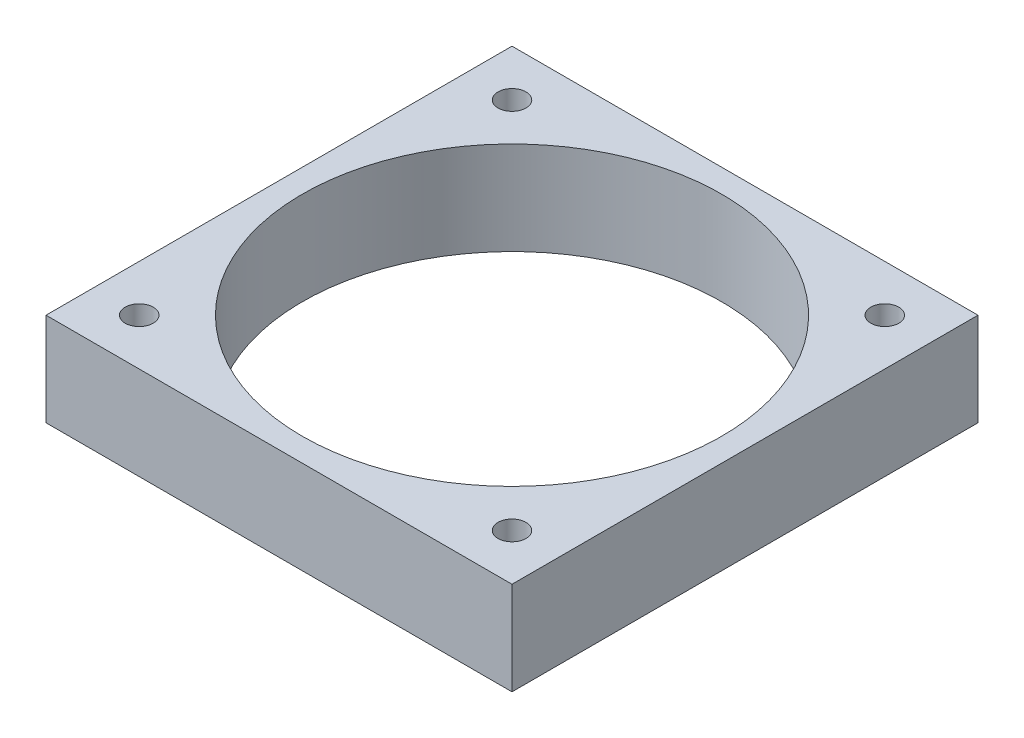
ISO-10303-21;
HEADER;
FILE_DESCRIPTION(('STEP AP214'),'2;1');
FILE_NAME('part.step','',(''),(''),'','','');
FILE_SCHEMA(('AUTOMOTIVE_DESIGN { 1 0 10303 214 1 1 1 1 }'));
ENDSEC;
DATA;
#1=APPLICATION_CONTEXT('core data for automotive mechanical design processes');
#2=APPLICATION_PROTOCOL_DEFINITION('international standard','automotive_design',2000,#1);
#3=PRODUCT_CONTEXT('',#1,'mechanical');
#4=PRODUCT('Part','Part','',(#3));
#5=PRODUCT_RELATED_PRODUCT_CATEGORY('part','',(#4));
#6=PRODUCT_DEFINITION_FORMATION('','',#4);
#7=PRODUCT_DEFINITION_CONTEXT('part definition',#1,'design');
#8=PRODUCT_DEFINITION('design','',#6,#7);
#9=PRODUCT_DEFINITION_SHAPE('','',#8);
#10=(LENGTH_UNIT() NAMED_UNIT(*) SI_UNIT(.MILLI.,.METRE.));
#11=(NAMED_UNIT(*) PLANE_ANGLE_UNIT() SI_UNIT($,.RADIAN.));
#12=(NAMED_UNIT(*) SI_UNIT($,.STERADIAN.) SOLID_ANGLE_UNIT());
#13=UNCERTAINTY_MEASURE_WITH_UNIT(LENGTH_MEASURE(1.E-05),#10,'distance_accuracy_value','');
#14=(GEOMETRIC_REPRESENTATION_CONTEXT(3) GLOBAL_UNCERTAINTY_ASSIGNED_CONTEXT((#13)) GLOBAL_UNIT_ASSIGNED_CONTEXT((#10,
#11,#12)) REPRESENTATION_CONTEXT('',''));
#15=CARTESIAN_POINT('',(0.,0.,0.));
#16=DIRECTION('',(0.,0.,1.));
#17=DIRECTION('',(1.,0.,0.));
#18=AXIS2_PLACEMENT_3D('',#15,#16,#17);
#19=CARTESIAN_POINT('',(0.,10.,-25.));
#20=DIRECTION('',(0.,0.,1.));
#21=DIRECTION('',(1.,0.,0.));
#22=AXIS2_PLACEMENT_3D('',#19,#20,#21);
#23=PLANE('',#22);
#24=DIRECTION('',(-1.,0.,0.));
#25=VECTOR('',#24,1.);
#26=CARTESIAN_POINT('',(0.,0.,-25.));
#27=LINE('',#26,#25);
#28=CARTESIAN_POINT('',(25.,0.,-25.));
#29=VERTEX_POINT('',#28);
#30=CARTESIAN_POINT('',(-25.,0.,-25.));
#31=VERTEX_POINT('',#30);
#32=EDGE_CURVE('E114',#29,#31,#27,.T.);
#33=ORIENTED_EDGE('',*,*,#32,.T.);
#34=DIRECTION('',(0.,-1.,0.));
#35=VECTOR('',#34,1.);
#36=CARTESIAN_POINT('',(-25.,10.,-25.));
#37=LINE('',#36,#35);
#38=CARTESIAN_POINT('',(-25.,10.,-25.));
#39=VERTEX_POINT('',#38);
#40=EDGE_CURVE('E11',#39,#31,#37,.T.);
#41=ORIENTED_EDGE('',*,*,#40,.F.);
#42=DIRECTION('',(-1.,0.,0.));
#43=VECTOR('',#42,1.);
#44=CARTESIAN_POINT('',(0.,10.,-25.));
#45=LINE('',#44,#43);
#46=CARTESIAN_POINT('',(25.,10.,-25.));
#47=VERTEX_POINT('',#46);
#48=EDGE_CURVE('E85',#47,#39,#45,.T.);
#49=ORIENTED_EDGE('',*,*,#48,.F.);
#50=DIRECTION('',(0.,-1.,0.));
#51=VECTOR('',#50,1.);
#52=CARTESIAN_POINT('',(25.,10.,-25.));
#53=LINE('',#52,#51);
#54=EDGE_CURVE('E52',#47,#29,#53,.T.);
#55=ORIENTED_EDGE('',*,*,#54,.T.);
#56=EDGE_LOOP('',(#33,#41,#49,#55));
#57=FACE_BOUND('',#56,.T.);
#58=ADVANCED_FACE('F35',(#57),#23,.F.);
#59=CARTESIAN_POINT('',(-25.,10.,0.));
#60=DIRECTION('',(1.,0.,0.));
#61=DIRECTION('',(0.,0.,-1.));
#62=AXIS2_PLACEMENT_3D('',#59,#60,#61);
#63=PLANE('',#62);
#64=DIRECTION('',(0.,0.,1.));
#65=VECTOR('',#64,1.);
#66=CARTESIAN_POINT('',(-25.,0.,0.));
#67=LINE('',#66,#65);
#68=CARTESIAN_POINT('',(-25.,0.,25.));
#69=VERTEX_POINT('',#68);
#70=EDGE_CURVE('E90',#31,#69,#67,.T.);
#71=ORIENTED_EDGE('',*,*,#70,.T.);
#72=DIRECTION('',(0.,-1.,0.));
#73=VECTOR('',#72,1.);
#74=CARTESIAN_POINT('',(-25.,10.,25.));
#75=LINE('',#74,#73);
#76=CARTESIAN_POINT('',(-25.,10.,25.));
#77=VERTEX_POINT('',#76);
#78=EDGE_CURVE('E44',#77,#69,#75,.T.);
#79=ORIENTED_EDGE('',*,*,#78,.F.);
#80=DIRECTION('',(0.,0.,1.));
#81=VECTOR('',#80,1.);
#82=CARTESIAN_POINT('',(-25.,10.,0.));
#83=LINE('',#82,#81);
#84=EDGE_CURVE('E77',#39,#77,#83,.T.);
#85=ORIENTED_EDGE('',*,*,#84,.F.);
#86=ORIENTED_EDGE('',*,*,#40,.T.);
#87=EDGE_LOOP('',(#71,#79,#85,#86));
#88=FACE_BOUND('',#87,.T.);
#89=ADVANCED_FACE('F89',(#88),#63,.F.);
#90=CARTESIAN_POINT('',(0.,10.,25.));
#91=DIRECTION('',(0.,0.,1.));
#92=DIRECTION('',(1.,0.,0.));
#93=AXIS2_PLACEMENT_3D('',#90,#91,#92);
#94=PLANE('',#93);
#95=DIRECTION('',(-1.,0.,0.));
#96=VECTOR('',#95,1.);
#97=CARTESIAN_POINT('',(0.,0.,25.));
#98=LINE('',#97,#96);
#99=CARTESIAN_POINT('',(25.,0.,25.));
#100=VERTEX_POINT('',#99);
#101=EDGE_CURVE('E117',#100,#69,#98,.T.);
#102=ORIENTED_EDGE('',*,*,#101,.F.);
#103=DIRECTION('',(0.,-1.,0.));
#104=VECTOR('',#103,1.);
#105=CARTESIAN_POINT('',(25.,10.,25.));
#106=LINE('',#105,#104);
#107=CARTESIAN_POINT('',(25.,10.,25.));
#108=VERTEX_POINT('',#107);
#109=EDGE_CURVE('E66',#108,#100,#106,.T.);
#110=ORIENTED_EDGE('',*,*,#109,.F.);
#111=DIRECTION('',(-1.,0.,0.));
#112=VECTOR('',#111,1.);
#113=CARTESIAN_POINT('',(0.,10.,25.));
#114=LINE('',#113,#112);
#115=EDGE_CURVE('E84',#108,#77,#114,.T.);
#116=ORIENTED_EDGE('',*,*,#115,.T.);
#117=ORIENTED_EDGE('',*,*,#78,.T.);
#118=EDGE_LOOP('',(#102,#110,#116,#117));
#119=FACE_BOUND('',#118,.T.);
#120=ADVANCED_FACE('F93',(#119),#94,.T.);
#121=CARTESIAN_POINT('',(-20.,10.,-20.));
#122=DIRECTION('',(0.,-1.,0.));
#123=DIRECTION('',(0.,0.,-1.));
#124=AXIS2_PLACEMENT_3D('',#121,#122,#123);
#125=CYLINDRICAL_SURFACE('',#124,1.5);
#126=CARTESIAN_POINT('',(-20.,10.,-20.));
#127=DIRECTION('',(0.,1.,0.));
#128=DIRECTION('',(0.,0.,1.));
#129=AXIS2_PLACEMENT_3D('',#126,#127,#128);
#130=CIRCLE('',#129,1.5);
#131=CARTESIAN_POINT('',(-20.,10.,-18.5));
#132=VERTEX_POINT('',#131);
#133=EDGE_CURVE('E139',#132,#132,#130,.T.);
#134=ORIENTED_EDGE('',*,*,#133,.T.);
#135=EDGE_LOOP('',(#134));
#136=FACE_BOUND('',#135,.T.);
#137=CARTESIAN_POINT('',(-20.,0.,-20.));
#138=DIRECTION('',(0.,1.,0.));
#139=DIRECTION('',(0.,0.,1.));
#140=AXIS2_PLACEMENT_3D('',#137,#138,#139);
#141=CIRCLE('',#140,1.5);
#142=CARTESIAN_POINT('',(-20.,0.,-18.5));
#143=VERTEX_POINT('',#142);
#144=EDGE_CURVE('E111',#143,#143,#141,.T.);
#145=ORIENTED_EDGE('',*,*,#144,.F.);
#146=EDGE_LOOP('',(#145));
#147=FACE_BOUND('',#146,.T.);
#148=ADVANCED_FACE('F143',(#136,#147),#125,.F.);
#149=CARTESIAN_POINT('',(20.,10.,-20.));
#150=DIRECTION('',(0.,-1.,0.));
#151=DIRECTION('',(0.,0.,-1.));
#152=AXIS2_PLACEMENT_3D('',#149,#150,#151);
#153=CYLINDRICAL_SURFACE('',#152,1.5);
#154=CARTESIAN_POINT('',(20.,10.,-20.));
#155=DIRECTION('',(0.,1.,0.));
#156=DIRECTION('',(0.,0.,1.));
#157=AXIS2_PLACEMENT_3D('',#154,#155,#156);
#158=CIRCLE('',#157,1.5);
#159=CARTESIAN_POINT('',(20.,10.,-18.5));
#160=VERTEX_POINT('',#159);
#161=EDGE_CURVE('E136',#160,#160,#158,.T.);
#162=ORIENTED_EDGE('',*,*,#161,.T.);
#163=EDGE_LOOP('',(#162));
#164=FACE_BOUND('',#163,.T.);
#165=CARTESIAN_POINT('',(20.,0.,-20.));
#166=DIRECTION('',(0.,1.,0.));
#167=DIRECTION('',(0.,0.,1.));
#168=AXIS2_PLACEMENT_3D('',#165,#166,#167);
#169=CIRCLE('',#168,1.5);
#170=CARTESIAN_POINT('',(20.,0.,-18.5));
#171=VERTEX_POINT('',#170);
#172=EDGE_CURVE('E108',#171,#171,#169,.T.);
#173=ORIENTED_EDGE('',*,*,#172,.F.);
#174=EDGE_LOOP('',(#173));
#175=FACE_BOUND('',#174,.T.);
#176=ADVANCED_FACE('F169',(#164,#175),#153,.F.);
#177=CARTESIAN_POINT('',(-20.,10.,20.));
#178=DIRECTION('',(0.,-1.,0.));
#179=DIRECTION('',(0.,0.,-1.));
#180=AXIS2_PLACEMENT_3D('',#177,#178,#179);
#181=CYLINDRICAL_SURFACE('',#180,1.5);
#182=CARTESIAN_POINT('',(-20.,10.,20.));
#183=DIRECTION('',(0.,1.,0.));
#184=DIRECTION('',(0.,0.,1.));
#185=AXIS2_PLACEMENT_3D('',#182,#183,#184);
#186=CIRCLE('',#185,1.5);
#187=CARTESIAN_POINT('',(-20.,10.,21.5));
#188=VERTEX_POINT('',#187);
#189=EDGE_CURVE('E131',#188,#188,#186,.T.);
#190=ORIENTED_EDGE('',*,*,#189,.T.);
#191=EDGE_LOOP('',(#190));
#192=FACE_BOUND('',#191,.T.);
#193=CARTESIAN_POINT('',(-20.,0.,20.));
#194=DIRECTION('',(0.,1.,0.));
#195=DIRECTION('',(0.,0.,1.));
#196=AXIS2_PLACEMENT_3D('',#193,#194,#195);
#197=CIRCLE('',#196,1.5);
#198=CARTESIAN_POINT('',(-20.,0.,21.5));
#199=VERTEX_POINT('',#198);
#200=EDGE_CURVE('E105',#199,#199,#197,.T.);
#201=ORIENTED_EDGE('',*,*,#200,.F.);
#202=EDGE_LOOP('',(#201));
#203=FACE_BOUND('',#202,.T.);
#204=ADVANCED_FACE('F172',(#192,#203),#181,.F.);
#205=CARTESIAN_POINT('',(20.,10.,20.));
#206=DIRECTION('',(0.,-1.,0.));
#207=DIRECTION('',(0.,0.,-1.));
#208=AXIS2_PLACEMENT_3D('',#205,#206,#207);
#209=CYLINDRICAL_SURFACE('',#208,1.5);
#210=CARTESIAN_POINT('',(20.,10.,20.));
#211=DIRECTION('',(0.,1.,0.));
#212=DIRECTION('',(0.,0.,1.));
#213=AXIS2_PLACEMENT_3D('',#210,#211,#212);
#214=CIRCLE('',#213,1.5);
#215=CARTESIAN_POINT('',(20.,10.,21.5));
#216=VERTEX_POINT('',#215);
#217=EDGE_CURVE('E126',#216,#216,#214,.T.);
#218=ORIENTED_EDGE('',*,*,#217,.T.);
#219=EDGE_LOOP('',(#218));
#220=FACE_BOUND('',#219,.T.);
#221=CARTESIAN_POINT('',(20.,0.,20.));
#222=DIRECTION('',(0.,1.,0.));
#223=DIRECTION('',(0.,0.,1.));
#224=AXIS2_PLACEMENT_3D('',#221,#222,#223);
#225=CIRCLE('',#224,1.5);
#226=CARTESIAN_POINT('',(20.,0.,21.5));
#227=VERTEX_POINT('',#226);
#228=EDGE_CURVE('E102',#227,#227,#225,.T.);
#229=ORIENTED_EDGE('',*,*,#228,.F.);
#230=EDGE_LOOP('',(#229));
#231=FACE_BOUND('',#230,.T.);
#232=ADVANCED_FACE('F175',(#220,#231),#209,.F.);
#233=CARTESIAN_POINT('',(0.,10.,0.));
#234=DIRECTION('',(0.,-1.,0.));
#235=DIRECTION('',(0.,0.,-1.));
#236=AXIS2_PLACEMENT_3D('',#233,#234,#235);
#237=CYLINDRICAL_SURFACE('',#236,22.5);
#238=CARTESIAN_POINT('',(0.,10.,0.));
#239=DIRECTION('',(0.,1.,0.));
#240=DIRECTION('',(0.,0.,1.));
#241=AXIS2_PLACEMENT_3D('',#238,#239,#240);
#242=CIRCLE('',#241,22.5);
#243=CARTESIAN_POINT('',(0.,10.,22.5));
#244=VERTEX_POINT('',#243);
#245=EDGE_CURVE('E122',#244,#244,#242,.T.);
#246=ORIENTED_EDGE('',*,*,#245,.T.);
#247=EDGE_LOOP('',(#246));
#248=FACE_BOUND('',#247,.T.);
#249=CARTESIAN_POINT('',(0.,0.,0.));
#250=DIRECTION('',(0.,1.,0.));
#251=DIRECTION('',(0.,0.,1.));
#252=AXIS2_PLACEMENT_3D('',#249,#250,#251);
#253=CIRCLE('',#252,22.5);
#254=CARTESIAN_POINT('',(0.,0.,22.5));
#255=VERTEX_POINT('',#254);
#256=EDGE_CURVE('E99',#255,#255,#253,.T.);
#257=ORIENTED_EDGE('',*,*,#256,.F.);
#258=EDGE_LOOP('',(#257));
#259=FACE_BOUND('',#258,.T.);
#260=ADVANCED_FACE('F37',(#248,#259),#237,.F.);
#261=CARTESIAN_POINT('',(25.,10.,0.));
#262=DIRECTION('',(1.,0.,0.));
#263=DIRECTION('',(0.,0.,-1.));
#264=AXIS2_PLACEMENT_3D('',#261,#262,#263);
#265=PLANE('',#264);
#266=DIRECTION('',(0.,0.,1.));
#267=VECTOR('',#266,1.);
#268=CARTESIAN_POINT('',(25.,0.,0.));
#269=LINE('',#268,#267);
#270=EDGE_CURVE('E119',#29,#100,#269,.T.);
#271=ORIENTED_EDGE('',*,*,#270,.F.);
#272=ORIENTED_EDGE('',*,*,#54,.F.);
#273=DIRECTION('',(0.,0.,1.));
#274=VECTOR('',#273,1.);
#275=CARTESIAN_POINT('',(25.,10.,0.));
#276=LINE('',#275,#274);
#277=EDGE_CURVE('E94',#47,#108,#276,.T.);
#278=ORIENTED_EDGE('',*,*,#277,.T.);
#279=ORIENTED_EDGE('',*,*,#109,.T.);
#280=EDGE_LOOP('',(#271,#272,#278,#279));
#281=FACE_BOUND('',#280,.T.);
#282=ADVANCED_FACE('F148',(#281),#265,.T.);
#283=CARTESIAN_POINT('',(0.,10.,0.));
#284=DIRECTION('',(0.,1.,0.));
#285=DIRECTION('',(0.,0.,1.));
#286=AXIS2_PLACEMENT_3D('',#283,#284,#285);
#287=PLANE('',#286);
#288=ORIENTED_EDGE('',*,*,#245,.F.);
#289=EDGE_LOOP('',(#288));
#290=FACE_BOUND('',#289,.T.);
#291=ORIENTED_EDGE('',*,*,#217,.F.);
#292=EDGE_LOOP('',(#291));
#293=FACE_BOUND('',#292,.T.);
#294=ORIENTED_EDGE('',*,*,#189,.F.);
#295=EDGE_LOOP('',(#294));
#296=FACE_BOUND('',#295,.T.);
#297=ORIENTED_EDGE('',*,*,#161,.F.);
#298=EDGE_LOOP('',(#297));
#299=FACE_BOUND('',#298,.T.);
#300=ORIENTED_EDGE('',*,*,#133,.F.);
#301=EDGE_LOOP('',(#300));
#302=FACE_BOUND('',#301,.T.);
#303=ORIENTED_EDGE('',*,*,#48,.T.);
#304=ORIENTED_EDGE('',*,*,#84,.T.);
#305=ORIENTED_EDGE('',*,*,#115,.F.);
#306=ORIENTED_EDGE('',*,*,#277,.F.);
#307=EDGE_LOOP('',(#303,#304,#305,#306));
#308=FACE_BOUND('',#307,.T.);
#309=ADVANCED_FACE('F81',(#290,#293,#296,#299,#302,#308),#287,.T.);
#310=CARTESIAN_POINT('',(0.,0.,0.));
#311=DIRECTION('',(0.,1.,0.));
#312=DIRECTION('',(0.,0.,1.));
#313=AXIS2_PLACEMENT_3D('',#310,#311,#312);
#314=PLANE('',#313);
#315=ORIENTED_EDGE('',*,*,#256,.T.);
#316=EDGE_LOOP('',(#315));
#317=FACE_BOUND('',#316,.T.);
#318=ORIENTED_EDGE('',*,*,#228,.T.);
#319=EDGE_LOOP('',(#318));
#320=FACE_BOUND('',#319,.T.);
#321=ORIENTED_EDGE('',*,*,#200,.T.);
#322=EDGE_LOOP('',(#321));
#323=FACE_BOUND('',#322,.T.);
#324=ORIENTED_EDGE('',*,*,#172,.T.);
#325=EDGE_LOOP('',(#324));
#326=FACE_BOUND('',#325,.T.);
#327=ORIENTED_EDGE('',*,*,#144,.T.);
#328=EDGE_LOOP('',(#327));
#329=FACE_BOUND('',#328,.T.);
#330=ORIENTED_EDGE('',*,*,#32,.F.);
#331=ORIENTED_EDGE('',*,*,#270,.T.);
#332=ORIENTED_EDGE('',*,*,#101,.T.);
#333=ORIENTED_EDGE('',*,*,#70,.F.);
#334=EDGE_LOOP('',(#330,#331,#332,#333));
#335=FACE_BOUND('',#334,.T.);
#336=ADVANCED_FACE('F147',(#317,#320,#323,#326,#329,#335),#314,.F.);
#337=CLOSED_SHELL('',(#58,#89,#120,#148,#176,#204,#232,#260,#282,#309,#336));
#338=MANIFOLD_SOLID_BREP('B2',#337);
#339=ADVANCED_BREP_SHAPE_REPRESENTATION('',(#18,#338),#14);
#340=SHAPE_DEFINITION_REPRESENTATION(#9,#339);
ENDSEC;
END-ISO-10303-21;
